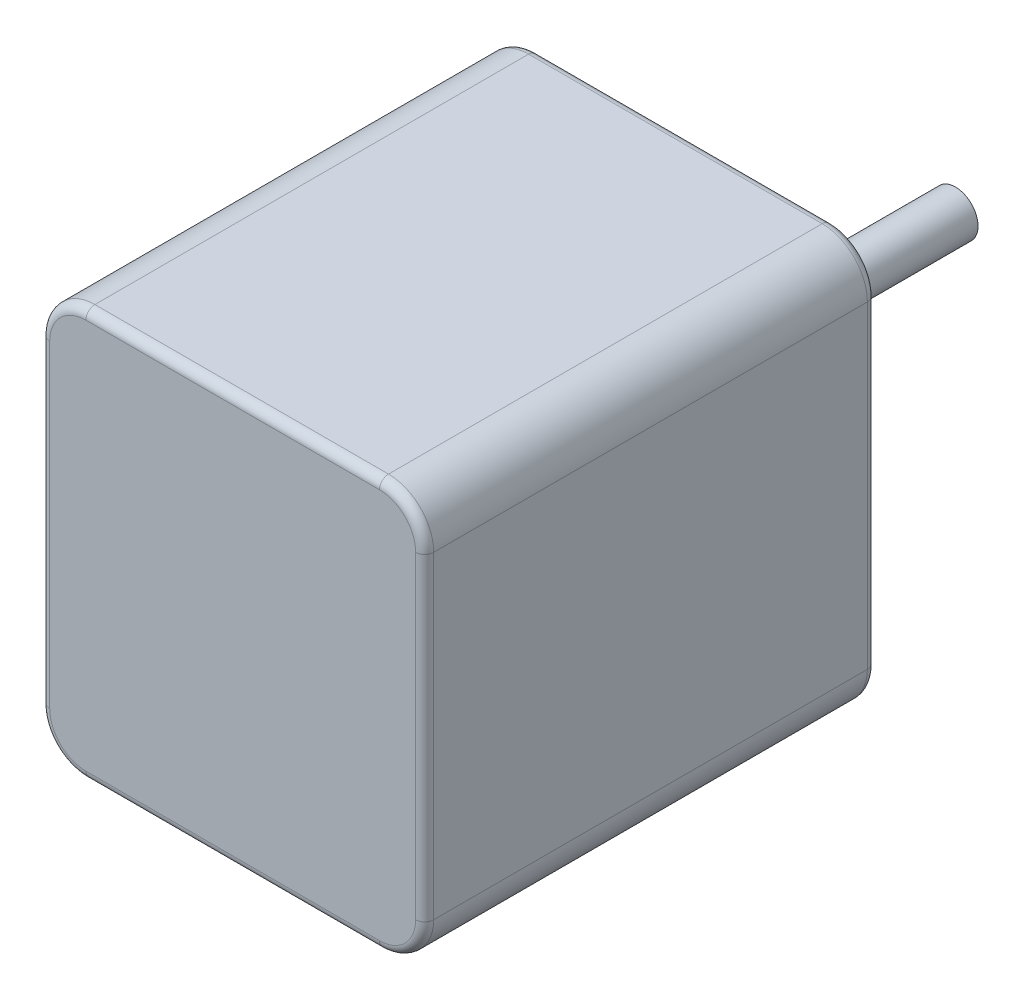
ISO-10303-21;
HEADER;
FILE_DESCRIPTION(('STEP AP214'),'2;1');
FILE_NAME('part.step','',(''),(''),'','','');
FILE_SCHEMA(('AUTOMOTIVE_DESIGN { 1 0 10303 214 1 1 1 1 }'));
ENDSEC;
DATA;
#1=APPLICATION_CONTEXT('core data for automotive mechanical design processes');
#2=APPLICATION_PROTOCOL_DEFINITION('international standard','automotive_design',2000,#1);
#3=PRODUCT_CONTEXT('',#1,'mechanical');
#4=PRODUCT('Part','Part','',(#3));
#5=PRODUCT_RELATED_PRODUCT_CATEGORY('part','',(#4));
#6=PRODUCT_DEFINITION_FORMATION('','',#4);
#7=PRODUCT_DEFINITION_CONTEXT('part definition',#1,'design');
#8=PRODUCT_DEFINITION('design','',#6,#7);
#9=PRODUCT_DEFINITION_SHAPE('','',#8);
#10=(LENGTH_UNIT() NAMED_UNIT(*) SI_UNIT(.MILLI.,.METRE.));
#11=(NAMED_UNIT(*) PLANE_ANGLE_UNIT() SI_UNIT($,.RADIAN.));
#12=(NAMED_UNIT(*) SI_UNIT($,.STERADIAN.) SOLID_ANGLE_UNIT());
#13=UNCERTAINTY_MEASURE_WITH_UNIT(LENGTH_MEASURE(1.E-05),#10,'distance_accuracy_value','');
#14=(GEOMETRIC_REPRESENTATION_CONTEXT(3) GLOBAL_UNCERTAINTY_ASSIGNED_CONTEXT((#13)) GLOBAL_UNIT_ASSIGNED_CONTEXT((#10,
#11,#12)) REPRESENTATION_CONTEXT('',''));
#15=CARTESIAN_POINT('',(0.,0.,0.));
#16=DIRECTION('',(0.,0.,1.));
#17=DIRECTION('',(1.,0.,0.));
#18=AXIS2_PLACEMENT_3D('',#15,#16,#17);
#19=CARTESIAN_POINT('',(21.25,-22.6104685857179,50.));
#20=DIRECTION('',(-1.,0.,0.));
#21=DIRECTION('',(0.,0.,1.));
#22=AXIS2_PLACEMENT_3D('',#19,#20,#21);
#23=PLANE('',#22);
#24=DIRECTION('',(0.,0.,-1.));
#25=VECTOR('',#24,1.);
#26=CARTESIAN_POINT('',(21.25,-17.6104685857179,50.));
#27=LINE('',#26,#25);
#28=CARTESIAN_POINT('',(21.25,-17.6104685857179,49.));
#29=VERTEX_POINT('',#28);
#30=CARTESIAN_POINT('',(21.25,-17.6104685857179,1.));
#31=VERTEX_POINT('',#30);
#32=EDGE_CURVE('E169',#29,#31,#27,.T.);
#33=ORIENTED_EDGE('',*,*,#32,.T.);
#34=DIRECTION('',(0.,1.,0.));
#35=VECTOR('',#34,1.);
#36=CARTESIAN_POINT('',(21.25,17.6104685857179,1.));
#37=LINE('',#36,#35);
#38=CARTESIAN_POINT('',(21.25,17.6104685857179,1.));
#39=VERTEX_POINT('',#38);
#40=EDGE_CURVE('E11',#31,#39,#37,.T.);
#41=ORIENTED_EDGE('',*,*,#40,.T.);
#42=DIRECTION('',(0.,0.,-1.));
#43=VECTOR('',#42,1.);
#44=CARTESIAN_POINT('',(21.25,17.6104685857179,50.));
#45=LINE('',#44,#43);
#46=CARTESIAN_POINT('',(21.25,17.6104685857179,49.));
#47=VERTEX_POINT('',#46);
#48=EDGE_CURVE('E285',#39,#47,#45,.F.);
#49=ORIENTED_EDGE('',*,*,#48,.T.);
#50=DIRECTION('',(0.,1.,0.));
#51=VECTOR('',#50,1.);
#52=CARTESIAN_POINT('',(21.25,-22.6104685857179,49.));
#53=LINE('',#52,#51);
#54=EDGE_CURVE('E176',#47,#29,#53,.F.);
#55=ORIENTED_EDGE('',*,*,#54,.T.);
#56=EDGE_LOOP('',(#33,#41,#49,#55));
#57=FACE_BOUND('',#56,.T.);
#58=ADVANCED_FACE('F33',(#57),#23,.F.);
#59=CARTESIAN_POINT('',(-21.25,22.6104685857179,50.));
#60=DIRECTION('',(0.,-1.,0.));
#61=DIRECTION('',(0.,0.,-1.));
#62=AXIS2_PLACEMENT_3D('',#59,#60,#61);
#63=PLANE('',#62);
#64=DIRECTION('',(0.,0.,-1.));
#65=VECTOR('',#64,1.);
#66=CARTESIAN_POINT('',(16.25,22.6104685857179,50.));
#67=LINE('',#66,#65);
#68=CARTESIAN_POINT('',(16.25,22.6104685857179,49.));
#69=VERTEX_POINT('',#68);
#70=CARTESIAN_POINT('',(16.25,22.6104685857179,1.));
#71=VERTEX_POINT('',#70);
#72=EDGE_CURVE('E317',#69,#71,#67,.T.);
#73=ORIENTED_EDGE('',*,*,#72,.T.);
#74=DIRECTION('',(-1.,0.,0.));
#75=VECTOR('',#74,1.);
#76=CARTESIAN_POINT('',(-16.25,22.6104685857179,1.));
#77=LINE('',#76,#75);
#78=CARTESIAN_POINT('',(-16.25,22.6104685857179,1.));
#79=VERTEX_POINT('',#78);
#80=EDGE_CURVE('E236',#71,#79,#77,.T.);
#81=ORIENTED_EDGE('',*,*,#80,.T.);
#82=DIRECTION('',(0.,0.,-1.));
#83=VECTOR('',#82,1.);
#84=CARTESIAN_POINT('',(-16.25,22.6104685857179,50.));
#85=LINE('',#84,#83);
#86=CARTESIAN_POINT('',(-16.25,22.6104685857179,49.));
#87=VERTEX_POINT('',#86);
#88=EDGE_CURVE('E289',#79,#87,#85,.F.);
#89=ORIENTED_EDGE('',*,*,#88,.T.);
#90=DIRECTION('',(-1.,0.,0.));
#91=VECTOR('',#90,1.);
#92=CARTESIAN_POINT('',(-21.25,22.6104685857179,49.));
#93=LINE('',#92,#91);
#94=EDGE_CURVE('E196',#87,#69,#93,.F.);
#95=ORIENTED_EDGE('',*,*,#94,.T.);
#96=EDGE_LOOP('',(#73,#81,#89,#95));
#97=FACE_BOUND('',#96,.T.);
#98=ADVANCED_FACE('F349',(#97),#63,.F.);
#99=CARTESIAN_POINT('',(-21.25,-22.6104685857179,50.));
#100=DIRECTION('',(1.,0.,0.));
#101=DIRECTION('',(0.,0.,-1.));
#102=AXIS2_PLACEMENT_3D('',#99,#100,#101);
#103=PLANE('',#102);
#104=DIRECTION('',(0.,0.,-1.));
#105=VECTOR('',#104,1.);
#106=CARTESIAN_POINT('',(-21.25,17.6104685857179,50.));
#107=LINE('',#106,#105);
#108=CARTESIAN_POINT('',(-21.25,17.6104685857179,49.));
#109=VERTEX_POINT('',#108);
#110=CARTESIAN_POINT('',(-21.25,17.6104685857179,1.));
#111=VERTEX_POINT('',#110);
#112=EDGE_CURVE('E319',#109,#111,#107,.T.);
#113=ORIENTED_EDGE('',*,*,#112,.T.);
#114=DIRECTION('',(0.,-1.,0.));
#115=VECTOR('',#114,1.);
#116=CARTESIAN_POINT('',(-21.25,-17.6104685857179,1.));
#117=LINE('',#116,#115);
#118=CARTESIAN_POINT('',(-21.25,-17.6104685857179,1.));
#119=VERTEX_POINT('',#118);
#120=EDGE_CURVE('E240',#111,#119,#117,.T.);
#121=ORIENTED_EDGE('',*,*,#120,.T.);
#122=DIRECTION('',(0.,0.,-1.));
#123=VECTOR('',#122,1.);
#124=CARTESIAN_POINT('',(-21.25,-17.6104685857179,50.));
#125=LINE('',#124,#123);
#126=CARTESIAN_POINT('',(-21.25,-17.6104685857179,49.));
#127=VERTEX_POINT('',#126);
#128=EDGE_CURVE('E282',#119,#127,#125,.F.);
#129=ORIENTED_EDGE('',*,*,#128,.T.);
#130=DIRECTION('',(0.,-1.,0.));
#131=VECTOR('',#130,1.);
#132=CARTESIAN_POINT('',(-21.25,-22.6104685857179,49.));
#133=LINE('',#132,#131);
#134=EDGE_CURVE('E191',#127,#109,#133,.F.);
#135=ORIENTED_EDGE('',*,*,#134,.T.);
#136=EDGE_LOOP('',(#113,#121,#129,#135));
#137=FACE_BOUND('',#136,.T.);
#138=ADVANCED_FACE('F354',(#137),#103,.F.);
#139=CARTESIAN_POINT('',(-21.25,-22.6104685857179,50.));
#140=DIRECTION('',(0.,1.,0.));
#141=DIRECTION('',(0.,0.,1.));
#142=AXIS2_PLACEMENT_3D('',#139,#140,#141);
#143=PLANE('',#142);
#144=DIRECTION('',(0.,0.,-1.));
#145=VECTOR('',#144,1.);
#146=CARTESIAN_POINT('',(-16.25,-22.6104685857179,50.));
#147=LINE('',#146,#145);
#148=CARTESIAN_POINT('',(-16.25,-22.6104685857179,49.));
#149=VERTEX_POINT('',#148);
#150=CARTESIAN_POINT('',(-16.25,-22.6104685857179,1.));
#151=VERTEX_POINT('',#150);
#152=EDGE_CURVE('E280',#149,#151,#147,.T.);
#153=ORIENTED_EDGE('',*,*,#152,.T.);
#154=DIRECTION('',(1.,0.,0.));
#155=VECTOR('',#154,1.);
#156=CARTESIAN_POINT('',(16.25,-22.6104685857179,1.));
#157=LINE('',#156,#155);
#158=CARTESIAN_POINT('',(16.25,-22.6104685857179,1.));
#159=VERTEX_POINT('',#158);
#160=EDGE_CURVE('E57',#151,#159,#157,.T.);
#161=ORIENTED_EDGE('',*,*,#160,.T.);
#162=DIRECTION('',(0.,0.,-1.));
#163=VECTOR('',#162,1.);
#164=CARTESIAN_POINT('',(16.25,-22.6104685857179,50.));
#165=LINE('',#164,#163);
#166=CARTESIAN_POINT('',(16.25,-22.6104685857179,49.));
#167=VERTEX_POINT('',#166);
#168=EDGE_CURVE('E286',#159,#167,#165,.F.);
#169=ORIENTED_EDGE('',*,*,#168,.T.);
#170=DIRECTION('',(1.,0.,0.));
#171=VECTOR('',#170,1.);
#172=CARTESIAN_POINT('',(-21.25,-22.6104685857179,49.));
#173=LINE('',#172,#171);
#174=EDGE_CURVE('E186',#167,#149,#173,.F.);
#175=ORIENTED_EDGE('',*,*,#174,.T.);
#176=EDGE_LOOP('',(#153,#161,#169,#175));
#177=FACE_BOUND('',#176,.T.);
#178=ADVANCED_FACE('F283',(#177),#143,.F.);
#179=CARTESIAN_POINT('',(0.,0.,50.));
#180=DIRECTION('',(0.,0.,-1.));
#181=DIRECTION('',(-1.,0.,0.));
#182=AXIS2_PLACEMENT_3D('',#179,#180,#181);
#183=PLANE('',#182);
#184=DIRECTION('',(0.,1.,0.));
#185=VECTOR('',#184,1.);
#186=CARTESIAN_POINT('',(20.25,0.,50.));
#187=LINE('',#186,#185);
#188=CARTESIAN_POINT('',(20.25,-17.6104685857179,50.));
#189=VERTEX_POINT('',#188);
#190=CARTESIAN_POINT('',(20.25,17.6104685857179,50.));
#191=VERTEX_POINT('',#190);
#192=EDGE_CURVE('E173',#189,#191,#187,.T.);
#193=ORIENTED_EDGE('',*,*,#192,.T.);
#194=CARTESIAN_POINT('',(16.25,17.6104685857179,50.));
#195=DIRECTION('',(0.,0.,-1.));
#196=DIRECTION('',(-1.,0.,0.));
#197=AXIS2_PLACEMENT_3D('',#194,#195,#196);
#198=CIRCLE('',#197,4.);
#199=CARTESIAN_POINT('',(16.25,21.6104685857179,50.));
#200=VERTEX_POINT('',#199);
#201=EDGE_CURVE('E154',#191,#200,#198,.F.);
#202=ORIENTED_EDGE('',*,*,#201,.T.);
#203=DIRECTION('',(-1.,0.,0.));
#204=VECTOR('',#203,1.);
#205=CARTESIAN_POINT('',(0.,21.6104685857179,50.));
#206=LINE('',#205,#204);
#207=CARTESIAN_POINT('',(-16.25,21.6104685857179,50.));
#208=VERTEX_POINT('',#207);
#209=EDGE_CURVE('E162',#200,#208,#206,.T.);
#210=ORIENTED_EDGE('',*,*,#209,.T.);
#211=CARTESIAN_POINT('',(-16.25,17.6104685857179,50.));
#212=DIRECTION('',(0.,0.,-1.));
#213=DIRECTION('',(-1.,0.,0.));
#214=AXIS2_PLACEMENT_3D('',#211,#212,#213);
#215=CIRCLE('',#214,4.);
#216=CARTESIAN_POINT('',(-20.25,17.6104685857179,50.));
#217=VERTEX_POINT('',#216);
#218=EDGE_CURVE('E168',#208,#217,#215,.F.);
#219=ORIENTED_EDGE('',*,*,#218,.T.);
#220=DIRECTION('',(0.,-1.,0.));
#221=VECTOR('',#220,1.);
#222=CARTESIAN_POINT('',(-20.25,0.,50.));
#223=LINE('',#222,#221);
#224=CARTESIAN_POINT('',(-20.25,-17.6104685857179,50.));
#225=VERTEX_POINT('',#224);
#226=EDGE_CURVE('E295',#217,#225,#223,.T.);
#227=ORIENTED_EDGE('',*,*,#226,.T.);
#228=CARTESIAN_POINT('',(-16.25,-17.6104685857179,50.));
#229=DIRECTION('',(0.,0.,-1.));
#230=DIRECTION('',(-1.,0.,0.));
#231=AXIS2_PLACEMENT_3D('',#228,#229,#230);
#232=CIRCLE('',#231,4.);
#233=CARTESIAN_POINT('',(-16.25,-21.6104685857179,50.));
#234=VERTEX_POINT('',#233);
#235=EDGE_CURVE('E297',#225,#234,#232,.F.);
#236=ORIENTED_EDGE('',*,*,#235,.T.);
#237=DIRECTION('',(1.,0.,0.));
#238=VECTOR('',#237,1.);
#239=CARTESIAN_POINT('',(0.,-21.6104685857179,50.));
#240=LINE('',#239,#238);
#241=CARTESIAN_POINT('',(16.25,-21.6104685857179,50.));
#242=VERTEX_POINT('',#241);
#243=EDGE_CURVE('E299',#234,#242,#240,.T.);
#244=ORIENTED_EDGE('',*,*,#243,.T.);
#245=CARTESIAN_POINT('',(16.25,-17.6104685857179,50.));
#246=DIRECTION('',(0.,0.,-1.));
#247=DIRECTION('',(-1.,0.,0.));
#248=AXIS2_PLACEMENT_3D('',#245,#246,#247);
#249=CIRCLE('',#248,4.);
#250=EDGE_CURVE('E178',#242,#189,#249,.F.);
#251=ORIENTED_EDGE('',*,*,#250,.T.);
#252=EDGE_LOOP('',(#193,#202,#210,#219,#227,#236,#244,#251));
#253=FACE_BOUND('',#252,.T.);
#254=ADVANCED_FACE('F171',(#253),#183,.F.);
#255=CARTESIAN_POINT('',(0.,0.,0.));
#256=DIRECTION('',(0.,0.,-1.));
#257=DIRECTION('',(-1.,0.,0.));
#258=AXIS2_PLACEMENT_3D('',#255,#256,#257);
#259=PLANE('',#258);
#260=DIRECTION('',(-1.,0.,0.));
#261=VECTOR('',#260,1.);
#262=CARTESIAN_POINT('',(16.25,21.6104685857179,0.));
#263=LINE('',#262,#261);
#264=CARTESIAN_POINT('',(-16.25,21.6104685857179,0.));
#265=VERTEX_POINT('',#264);
#266=CARTESIAN_POINT('',(16.25,21.6104685857179,0.));
#267=VERTEX_POINT('',#266);
#268=EDGE_CURVE('E228',#265,#267,#263,.F.);
#269=ORIENTED_EDGE('',*,*,#268,.T.);
#270=CARTESIAN_POINT('',(16.25,17.6104685857179,0.));
#271=DIRECTION('',(0.,0.,-1.));
#272=DIRECTION('',(-1.,0.,0.));
#273=AXIS2_PLACEMENT_3D('',#270,#271,#272);
#274=CIRCLE('',#273,4.);
#275=CARTESIAN_POINT('',(20.25,17.6104685857179,0.));
#276=VERTEX_POINT('',#275);
#277=EDGE_CURVE('E230',#267,#276,#274,.T.);
#278=ORIENTED_EDGE('',*,*,#277,.T.);
#279=DIRECTION('',(0.,1.,0.));
#280=VECTOR('',#279,1.);
#281=CARTESIAN_POINT('',(20.25,-17.6104685857179,0.));
#282=LINE('',#281,#280);
#283=CARTESIAN_POINT('',(20.25,-17.6104685857179,0.));
#284=VERTEX_POINT('',#283);
#285=EDGE_CURVE('E197',#276,#284,#282,.F.);
#286=ORIENTED_EDGE('',*,*,#285,.T.);
#287=CARTESIAN_POINT('',(16.25,-17.6104685857179,0.));
#288=DIRECTION('',(0.,0.,-1.));
#289=DIRECTION('',(-1.,0.,0.));
#290=AXIS2_PLACEMENT_3D('',#287,#288,#289);
#291=CIRCLE('',#290,4.);
#292=CARTESIAN_POINT('',(16.25,-21.6104685857179,0.));
#293=VERTEX_POINT('',#292);
#294=EDGE_CURVE('E218',#284,#293,#291,.T.);
#295=ORIENTED_EDGE('',*,*,#294,.T.);
#296=DIRECTION('',(1.,0.,0.));
#297=VECTOR('',#296,1.);
#298=CARTESIAN_POINT('',(-16.25,-21.6104685857179,0.));
#299=LINE('',#298,#297);
#300=CARTESIAN_POINT('',(-16.25,-21.6104685857179,0.));
#301=VERTEX_POINT('',#300);
#302=EDGE_CURVE('E220',#293,#301,#299,.F.);
#303=ORIENTED_EDGE('',*,*,#302,.T.);
#304=CARTESIAN_POINT('',(-16.25,-17.6104685857179,0.));
#305=DIRECTION('',(0.,0.,-1.));
#306=DIRECTION('',(-1.,0.,0.));
#307=AXIS2_PLACEMENT_3D('',#304,#305,#306);
#308=CIRCLE('',#307,4.);
#309=CARTESIAN_POINT('',(-20.25,-17.6104685857179,0.));
#310=VERTEX_POINT('',#309);
#311=EDGE_CURVE('E222',#301,#310,#308,.T.);
#312=ORIENTED_EDGE('',*,*,#311,.T.);
#313=DIRECTION('',(0.,-1.,0.));
#314=VECTOR('',#313,1.);
#315=CARTESIAN_POINT('',(-20.25,17.6104685857179,0.));
#316=LINE('',#315,#314);
#317=CARTESIAN_POINT('',(-20.25,17.6104685857179,0.));
#318=VERTEX_POINT('',#317);
#319=EDGE_CURVE('E224',#310,#318,#316,.F.);
#320=ORIENTED_EDGE('',*,*,#319,.T.);
#321=CARTESIAN_POINT('',(-16.25,17.6104685857179,0.));
#322=DIRECTION('',(0.,0.,-1.));
#323=DIRECTION('',(-1.,0.,0.));
#324=AXIS2_PLACEMENT_3D('',#321,#322,#323);
#325=CIRCLE('',#324,4.);
#326=EDGE_CURVE('E226',#318,#265,#325,.T.);
#327=ORIENTED_EDGE('',*,*,#326,.T.);
#328=EDGE_LOOP('',(#269,#278,#286,#295,#303,#312,#320,#327));
#329=FACE_BOUND('',#328,.T.);
#330=CARTESIAN_POINT('',(0.,0.,0.));
#331=DIRECTION('',(0.,0.,-1.));
#332=DIRECTION('',(-1.,0.,0.));
#333=AXIS2_PLACEMENT_3D('',#330,#331,#332);
#334=CIRCLE('',#333,2.5);
#335=CARTESIAN_POINT('',(-2.5,0.,0.));
#336=VERTEX_POINT('',#335);
#337=EDGE_CURVE('E216',#336,#336,#334,.T.);
#338=ORIENTED_EDGE('',*,*,#337,.F.);
#339=EDGE_LOOP('',(#338));
#340=FACE_BOUND('',#339,.T.);
#341=ADVANCED_FACE('F336',(#329,#340),#259,.T.);
#342=CARTESIAN_POINT('',(0.,0.,-30.));
#343=DIRECTION('',(0.,0.,1.));
#344=DIRECTION('',(1.,0.,0.));
#345=AXIS2_PLACEMENT_3D('',#342,#343,#344);
#346=CYLINDRICAL_SURFACE('',#345,2.5);
#347=CARTESIAN_POINT('',(0.,0.,-30.));
#348=DIRECTION('',(0.,0.,-1.));
#349=DIRECTION('',(-1.,0.,0.));
#350=AXIS2_PLACEMENT_3D('',#347,#348,#349);
#351=CIRCLE('',#350,2.5);
#352=CARTESIAN_POINT('',(-2.5,0.,-30.));
#353=VERTEX_POINT('',#352);
#354=EDGE_CURVE('E325',#353,#353,#351,.T.);
#355=ORIENTED_EDGE('',*,*,#354,.F.);
#356=EDGE_LOOP('',(#355));
#357=FACE_BOUND('',#356,.T.);
#358=ORIENTED_EDGE('',*,*,#337,.T.);
#359=EDGE_LOOP('',(#358));
#360=FACE_BOUND('',#359,.T.);
#361=ADVANCED_FACE('F333',(#357,#360),#346,.T.);
#362=CARTESIAN_POINT('',(0.,0.,-30.));
#363=DIRECTION('',(0.,0.,-1.));
#364=DIRECTION('',(-1.,0.,0.));
#365=AXIS2_PLACEMENT_3D('',#362,#363,#364);
#366=PLANE('',#365);
#367=ORIENTED_EDGE('',*,*,#354,.T.);
#368=EDGE_LOOP('',(#367));
#369=FACE_BOUND('',#368,.T.);
#370=ADVANCED_FACE('F331',(#369),#366,.T.);
#371=CARTESIAN_POINT('',(-16.25,17.6104685857179,50.));
#372=DIRECTION('',(0.,0.,-1.));
#373=DIRECTION('',(-1.,0.,0.));
#374=AXIS2_PLACEMENT_3D('',#371,#372,#373);
#375=CYLINDRICAL_SURFACE('',#374,5.);
#376=ORIENTED_EDGE('',*,*,#88,.F.);
#377=CARTESIAN_POINT('',(-16.25,17.6104685857179,1.));
#378=DIRECTION('',(0.,0.,-1.));
#379=DIRECTION('',(-1.,0.,0.));
#380=AXIS2_PLACEMENT_3D('',#377,#378,#379);
#381=CIRCLE('',#380,5.);
#382=EDGE_CURVE('E238',#79,#111,#381,.F.);
#383=ORIENTED_EDGE('',*,*,#382,.T.);
#384=ORIENTED_EDGE('',*,*,#112,.F.);
#385=CARTESIAN_POINT('',(-16.25,17.6104685857179,49.));
#386=DIRECTION('',(0.,0.,-1.));
#387=DIRECTION('',(-1.,0.,0.));
#388=AXIS2_PLACEMENT_3D('',#385,#386,#387);
#389=CIRCLE('',#388,5.);
#390=EDGE_CURVE('E193',#109,#87,#389,.T.);
#391=ORIENTED_EDGE('',*,*,#390,.T.);
#392=EDGE_LOOP('',(#376,#383,#384,#391));
#393=FACE_BOUND('',#392,.T.);
#394=ADVANCED_FACE('F358',(#393),#375,.T.);
#395=CARTESIAN_POINT('',(-16.25,-17.6104685857179,50.));
#396=DIRECTION('',(0.,0.,-1.));
#397=DIRECTION('',(-1.,0.,0.));
#398=AXIS2_PLACEMENT_3D('',#395,#396,#397);
#399=CYLINDRICAL_SURFACE('',#398,5.);
#400=ORIENTED_EDGE('',*,*,#128,.F.);
#401=CARTESIAN_POINT('',(-16.25,-17.6104685857179,1.));
#402=DIRECTION('',(0.,0.,-1.));
#403=DIRECTION('',(-1.,0.,0.));
#404=AXIS2_PLACEMENT_3D('',#401,#402,#403);
#405=CIRCLE('',#404,5.);
#406=EDGE_CURVE('E242',#119,#151,#405,.F.);
#407=ORIENTED_EDGE('',*,*,#406,.T.);
#408=ORIENTED_EDGE('',*,*,#152,.F.);
#409=CARTESIAN_POINT('',(-16.25,-17.6104685857179,49.));
#410=DIRECTION('',(0.,0.,-1.));
#411=DIRECTION('',(-1.,0.,0.));
#412=AXIS2_PLACEMENT_3D('',#409,#410,#411);
#413=CIRCLE('',#412,5.);
#414=EDGE_CURVE('E188',#149,#127,#413,.T.);
#415=ORIENTED_EDGE('',*,*,#414,.T.);
#416=EDGE_LOOP('',(#400,#407,#408,#415));
#417=FACE_BOUND('',#416,.T.);
#418=ADVANCED_FACE('F279',(#417),#399,.T.);
#419=CARTESIAN_POINT('',(16.25,-17.6104685857179,50.));
#420=DIRECTION('',(0.,0.,-1.));
#421=DIRECTION('',(-1.,0.,0.));
#422=AXIS2_PLACEMENT_3D('',#419,#420,#421);
#423=CYLINDRICAL_SURFACE('',#422,5.);
#424=ORIENTED_EDGE('',*,*,#168,.F.);
#425=CARTESIAN_POINT('',(16.25,-17.6104685857179,1.));
#426=DIRECTION('',(0.,0.,-1.));
#427=DIRECTION('',(-1.,0.,0.));
#428=AXIS2_PLACEMENT_3D('',#425,#426,#427);
#429=CIRCLE('',#428,5.);
#430=EDGE_CURVE('E42',#159,#31,#429,.F.);
#431=ORIENTED_EDGE('',*,*,#430,.T.);
#432=ORIENTED_EDGE('',*,*,#32,.F.);
#433=CARTESIAN_POINT('',(16.25,-17.6104685857179,49.));
#434=DIRECTION('',(0.,0.,-1.));
#435=DIRECTION('',(-1.,0.,0.));
#436=AXIS2_PLACEMENT_3D('',#433,#434,#435);
#437=CIRCLE('',#436,5.);
#438=EDGE_CURVE('E183',#29,#167,#437,.T.);
#439=ORIENTED_EDGE('',*,*,#438,.T.);
#440=EDGE_LOOP('',(#424,#431,#432,#439));
#441=FACE_BOUND('',#440,.T.);
#442=ADVANCED_FACE('F364',(#441),#423,.T.);
#443=CARTESIAN_POINT('',(16.25,17.6104685857179,50.));
#444=DIRECTION('',(0.,0.,-1.));
#445=DIRECTION('',(-1.,0.,0.));
#446=AXIS2_PLACEMENT_3D('',#443,#444,#445);
#447=CYLINDRICAL_SURFACE('',#446,5.);
#448=ORIENTED_EDGE('',*,*,#48,.F.);
#449=CARTESIAN_POINT('',(16.25,17.6104685857179,1.));
#450=DIRECTION('',(0.,0.,-1.));
#451=DIRECTION('',(-1.,0.,0.));
#452=AXIS2_PLACEMENT_3D('',#449,#450,#451);
#453=CIRCLE('',#452,5.);
#454=EDGE_CURVE('E233',#39,#71,#453,.F.);
#455=ORIENTED_EDGE('',*,*,#454,.T.);
#456=ORIENTED_EDGE('',*,*,#72,.F.);
#457=CARTESIAN_POINT('',(16.25,17.6104685857179,49.));
#458=DIRECTION('',(0.,0.,-1.));
#459=DIRECTION('',(-1.,0.,0.));
#460=AXIS2_PLACEMENT_3D('',#457,#458,#459);
#461=CIRCLE('',#460,5.);
#462=EDGE_CURVE('E156',#69,#47,#461,.T.);
#463=ORIENTED_EDGE('',*,*,#462,.T.);
#464=EDGE_LOOP('',(#448,#455,#456,#463));
#465=FACE_BOUND('',#464,.T.);
#466=ADVANCED_FACE('F314',(#465),#447,.T.);
#467=CARTESIAN_POINT('',(-16.25,-17.6104685857179,49.));
#468=DIRECTION('',(0.,0.,-1.));
#469=DIRECTION('',(-1.,0.,0.));
#470=AXIS2_PLACEMENT_3D('',#467,#468,#469);
#471=TOROIDAL_SURFACE('',#470,4.,1.);
#472=CARTESIAN_POINT('',(-20.25,-17.6104685857179,49.));
#473=DIRECTION('',(0.,1.,0.));
#474=DIRECTION('',(0.,0.,1.));
#475=AXIS2_PLACEMENT_3D('',#472,#473,#474);
#476=CIRCLE('',#475,1.);
#477=EDGE_CURVE('E210',#127,#225,#476,.T.);
#478=ORIENTED_EDGE('',*,*,#477,.F.);
#479=ORIENTED_EDGE('',*,*,#414,.F.);
#480=CARTESIAN_POINT('',(-16.25,-21.6104685857179,49.));
#481=DIRECTION('',(1.,0.,0.));
#482=DIRECTION('',(0.,0.,-1.));
#483=AXIS2_PLACEMENT_3D('',#480,#481,#482);
#484=CIRCLE('',#483,1.);
#485=EDGE_CURVE('E213',#234,#149,#484,.T.);
#486=ORIENTED_EDGE('',*,*,#485,.F.);
#487=ORIENTED_EDGE('',*,*,#235,.F.);
#488=EDGE_LOOP('',(#478,#479,#486,#487));
#489=FACE_BOUND('',#488,.T.);
#490=ADVANCED_FACE('F369',(#489),#471,.T.);
#491=CARTESIAN_POINT('',(0.,-21.6104685857179,49.));
#492=DIRECTION('',(1.,0.,0.));
#493=DIRECTION('',(0.,0.,-1.));
#494=AXIS2_PLACEMENT_3D('',#491,#492,#493);
#495=CYLINDRICAL_SURFACE('',#494,1.);
#496=ORIENTED_EDGE('',*,*,#485,.T.);
#497=ORIENTED_EDGE('',*,*,#174,.F.);
#498=CARTESIAN_POINT('',(16.25,-21.6104685857179,49.));
#499=DIRECTION('',(1.,0.,0.));
#500=DIRECTION('',(0.,0.,-1.));
#501=AXIS2_PLACEMENT_3D('',#498,#499,#500);
#502=CIRCLE('',#501,1.);
#503=EDGE_CURVE('E207',#242,#167,#502,.T.);
#504=ORIENTED_EDGE('',*,*,#503,.F.);
#505=ORIENTED_EDGE('',*,*,#243,.F.);
#506=EDGE_LOOP('',(#496,#497,#504,#505));
#507=FACE_BOUND('',#506,.T.);
#508=ADVANCED_FACE('F385',(#507),#495,.T.);
#509=CARTESIAN_POINT('',(-20.25,0.,49.));
#510=DIRECTION('',(0.,-1.,0.));
#511=DIRECTION('',(0.,0.,-1.));
#512=AXIS2_PLACEMENT_3D('',#509,#510,#511);
#513=CYLINDRICAL_SURFACE('',#512,1.);
#514=ORIENTED_EDGE('',*,*,#477,.T.);
#515=ORIENTED_EDGE('',*,*,#226,.F.);
#516=CARTESIAN_POINT('',(-20.25,17.6104685857179,49.));
#517=DIRECTION('',(0.,1.,0.));
#518=DIRECTION('',(0.,0.,1.));
#519=AXIS2_PLACEMENT_3D('',#516,#517,#518);
#520=CIRCLE('',#519,1.);
#521=EDGE_CURVE('E204',#109,#217,#520,.T.);
#522=ORIENTED_EDGE('',*,*,#521,.F.);
#523=ORIENTED_EDGE('',*,*,#134,.F.);
#524=EDGE_LOOP('',(#514,#515,#522,#523));
#525=FACE_BOUND('',#524,.T.);
#526=ADVANCED_FACE('F382',(#525),#513,.T.);
#527=CARTESIAN_POINT('',(16.25,-17.6104685857179,49.));
#528=DIRECTION('',(0.,0.,-1.));
#529=DIRECTION('',(-1.,0.,0.));
#530=AXIS2_PLACEMENT_3D('',#527,#528,#529);
#531=TOROIDAL_SURFACE('',#530,4.,1.);
#532=ORIENTED_EDGE('',*,*,#503,.T.);
#533=ORIENTED_EDGE('',*,*,#438,.F.);
#534=CARTESIAN_POINT('',(20.25,-17.6104685857179,49.));
#535=DIRECTION('',(0.,1.,0.));
#536=DIRECTION('',(0.,0.,1.));
#537=AXIS2_PLACEMENT_3D('',#534,#535,#536);
#538=CIRCLE('',#537,1.);
#539=EDGE_CURVE('E201',#189,#29,#538,.T.);
#540=ORIENTED_EDGE('',*,*,#539,.F.);
#541=ORIENTED_EDGE('',*,*,#250,.F.);
#542=EDGE_LOOP('',(#532,#533,#540,#541));
#543=FACE_BOUND('',#542,.T.);
#544=ADVANCED_FACE('F306',(#543),#531,.T.);
#545=CARTESIAN_POINT('',(-16.25,17.6104685857179,49.));
#546=DIRECTION('',(0.,0.,-1.));
#547=DIRECTION('',(-1.,0.,0.));
#548=AXIS2_PLACEMENT_3D('',#545,#546,#547);
#549=TOROIDAL_SURFACE('',#548,4.,1.);
#550=ORIENTED_EDGE('',*,*,#521,.T.);
#551=ORIENTED_EDGE('',*,*,#218,.F.);
#552=CARTESIAN_POINT('',(-16.25,21.6104685857179,49.));
#553=DIRECTION('',(1.,0.,0.));
#554=DIRECTION('',(0.,0.,-1.));
#555=AXIS2_PLACEMENT_3D('',#552,#553,#554);
#556=CIRCLE('',#555,1.);
#557=EDGE_CURVE('E165',#87,#208,#556,.T.);
#558=ORIENTED_EDGE('',*,*,#557,.F.);
#559=ORIENTED_EDGE('',*,*,#390,.F.);
#560=EDGE_LOOP('',(#550,#551,#558,#559));
#561=FACE_BOUND('',#560,.T.);
#562=ADVANCED_FACE('F376',(#561),#549,.T.);
#563=CARTESIAN_POINT('',(20.25,0.,49.));
#564=DIRECTION('',(0.,1.,0.));
#565=DIRECTION('',(0.,0.,1.));
#566=AXIS2_PLACEMENT_3D('',#563,#564,#565);
#567=CYLINDRICAL_SURFACE('',#566,1.);
#568=ORIENTED_EDGE('',*,*,#539,.T.);
#569=ORIENTED_EDGE('',*,*,#54,.F.);
#570=CARTESIAN_POINT('',(20.25,17.6104685857179,49.));
#571=DIRECTION('',(0.,1.,0.));
#572=DIRECTION('',(0.,0.,1.));
#573=AXIS2_PLACEMENT_3D('',#570,#571,#572);
#574=CIRCLE('',#573,1.);
#575=EDGE_CURVE('E159',#191,#47,#574,.T.);
#576=ORIENTED_EDGE('',*,*,#575,.F.);
#577=ORIENTED_EDGE('',*,*,#192,.F.);
#578=EDGE_LOOP('',(#568,#569,#576,#577));
#579=FACE_BOUND('',#578,.T.);
#580=ADVANCED_FACE('F309',(#579),#567,.T.);
#581=CARTESIAN_POINT('',(0.,21.6104685857179,49.));
#582=DIRECTION('',(-1.,0.,0.));
#583=DIRECTION('',(0.,0.,1.));
#584=AXIS2_PLACEMENT_3D('',#581,#582,#583);
#585=CYLINDRICAL_SURFACE('',#584,1.);
#586=ORIENTED_EDGE('',*,*,#557,.T.);
#587=ORIENTED_EDGE('',*,*,#209,.F.);
#588=CARTESIAN_POINT('',(16.25,21.6104685857179,49.));
#589=DIRECTION('',(1.,0.,0.));
#590=DIRECTION('',(0.,0.,-1.));
#591=AXIS2_PLACEMENT_3D('',#588,#589,#590);
#592=CIRCLE('',#591,1.);
#593=EDGE_CURVE('E149',#69,#200,#592,.T.);
#594=ORIENTED_EDGE('',*,*,#593,.F.);
#595=ORIENTED_EDGE('',*,*,#94,.F.);
#596=EDGE_LOOP('',(#586,#587,#594,#595));
#597=FACE_BOUND('',#596,.T.);
#598=ADVANCED_FACE('F163',(#597),#585,.T.);
#599=CARTESIAN_POINT('',(16.25,17.6104685857179,49.));
#600=DIRECTION('',(0.,0.,-1.));
#601=DIRECTION('',(-1.,0.,0.));
#602=AXIS2_PLACEMENT_3D('',#599,#600,#601);
#603=TOROIDAL_SURFACE('',#602,4.,1.);
#604=ORIENTED_EDGE('',*,*,#575,.T.);
#605=ORIENTED_EDGE('',*,*,#462,.F.);
#606=ORIENTED_EDGE('',*,*,#593,.T.);
#607=ORIENTED_EDGE('',*,*,#201,.F.);
#608=EDGE_LOOP('',(#604,#605,#606,#607));
#609=FACE_BOUND('',#608,.T.);
#610=ADVANCED_FACE('F152',(#609),#603,.T.);
#611=CARTESIAN_POINT('',(-16.25,-17.6104685857179,1.));
#612=DIRECTION('',(0.,0.,-1.));
#613=DIRECTION('',(-1.,0.,0.));
#614=AXIS2_PLACEMENT_3D('',#611,#612,#613);
#615=TOROIDAL_SURFACE('',#614,4.,1.);
#616=CARTESIAN_POINT('',(-16.25,-21.6104685857179,1.));
#617=DIRECTION('',(1.,0.,0.));
#618=DIRECTION('',(0.,0.,-1.));
#619=AXIS2_PLACEMENT_3D('',#616,#617,#618);
#620=CIRCLE('',#619,1.);
#621=EDGE_CURVE('E261',#151,#301,#620,.T.);
#622=ORIENTED_EDGE('',*,*,#621,.F.);
#623=ORIENTED_EDGE('',*,*,#406,.F.);
#624=CARTESIAN_POINT('',(-20.25,-17.6104685857179,1.));
#625=DIRECTION('',(0.,1.,0.));
#626=DIRECTION('',(0.,0.,1.));
#627=AXIS2_PLACEMENT_3D('',#624,#625,#626);
#628=CIRCLE('',#627,1.);
#629=EDGE_CURVE('E37',#310,#119,#628,.T.);
#630=ORIENTED_EDGE('',*,*,#629,.F.);
#631=ORIENTED_EDGE('',*,*,#311,.F.);
#632=EDGE_LOOP('',(#622,#623,#630,#631));
#633=FACE_BOUND('',#632,.T.);
#634=ADVANCED_FACE('F35',(#633),#615,.T.);
#635=CARTESIAN_POINT('',(-20.25,-22.6104685857179,1.));
#636=DIRECTION('',(0.,1.,0.));
#637=DIRECTION('',(0.,0.,1.));
#638=AXIS2_PLACEMENT_3D('',#635,#636,#637);
#639=CYLINDRICAL_SURFACE('',#638,1.);
#640=ORIENTED_EDGE('',*,*,#629,.T.);
#641=ORIENTED_EDGE('',*,*,#120,.F.);
#642=CARTESIAN_POINT('',(-20.25,17.6104685857179,1.));
#643=DIRECTION('',(0.,1.,0.));
#644=DIRECTION('',(0.,0.,1.));
#645=AXIS2_PLACEMENT_3D('',#642,#643,#644);
#646=CIRCLE('',#645,1.);
#647=EDGE_CURVE('E259',#318,#111,#646,.T.);
#648=ORIENTED_EDGE('',*,*,#647,.F.);
#649=ORIENTED_EDGE('',*,*,#319,.F.);
#650=EDGE_LOOP('',(#640,#641,#648,#649));
#651=FACE_BOUND('',#650,.T.);
#652=ADVANCED_FACE('F271',(#651),#639,.T.);
#653=CARTESIAN_POINT('',(-21.25,-21.6104685857179,1.));
#654=DIRECTION('',(-1.,0.,0.));
#655=DIRECTION('',(0.,0.,1.));
#656=AXIS2_PLACEMENT_3D('',#653,#654,#655);
#657=CYLINDRICAL_SURFACE('',#656,1.);
#658=ORIENTED_EDGE('',*,*,#621,.T.);
#659=ORIENTED_EDGE('',*,*,#302,.F.);
#660=CARTESIAN_POINT('',(16.25,-21.6104685857179,1.));
#661=DIRECTION('',(1.,0.,0.));
#662=DIRECTION('',(0.,0.,-1.));
#663=AXIS2_PLACEMENT_3D('',#660,#661,#662);
#664=CIRCLE('',#663,1.);
#665=EDGE_CURVE('E256',#159,#293,#664,.T.);
#666=ORIENTED_EDGE('',*,*,#665,.F.);
#667=ORIENTED_EDGE('',*,*,#160,.F.);
#668=EDGE_LOOP('',(#658,#659,#666,#667));
#669=FACE_BOUND('',#668,.T.);
#670=ADVANCED_FACE('F412',(#669),#657,.T.);
#671=CARTESIAN_POINT('',(-16.25,17.6104685857179,1.));
#672=DIRECTION('',(0.,0.,-1.));
#673=DIRECTION('',(-1.,0.,0.));
#674=AXIS2_PLACEMENT_3D('',#671,#672,#673);
#675=TOROIDAL_SURFACE('',#674,4.,1.);
#676=ORIENTED_EDGE('',*,*,#647,.T.);
#677=ORIENTED_EDGE('',*,*,#382,.F.);
#678=CARTESIAN_POINT('',(-16.25,21.6104685857179,1.));
#679=DIRECTION('',(1.,0.,0.));
#680=DIRECTION('',(0.,0.,-1.));
#681=AXIS2_PLACEMENT_3D('',#678,#679,#680);
#682=CIRCLE('',#681,1.);
#683=EDGE_CURVE('E253',#265,#79,#682,.T.);
#684=ORIENTED_EDGE('',*,*,#683,.F.);
#685=ORIENTED_EDGE('',*,*,#326,.F.);
#686=EDGE_LOOP('',(#676,#677,#684,#685));
#687=FACE_BOUND('',#686,.T.);
#688=ADVANCED_FACE('F408',(#687),#675,.T.);
#689=CARTESIAN_POINT('',(16.25,-17.6104685857179,1.));
#690=DIRECTION('',(0.,0.,-1.));
#691=DIRECTION('',(-1.,0.,0.));
#692=AXIS2_PLACEMENT_3D('',#689,#690,#691);
#693=TOROIDAL_SURFACE('',#692,4.,1.);
#694=ORIENTED_EDGE('',*,*,#665,.T.);
#695=ORIENTED_EDGE('',*,*,#294,.F.);
#696=CARTESIAN_POINT('',(20.25,-17.6104685857179,1.));
#697=DIRECTION('',(0.,1.,0.));
#698=DIRECTION('',(0.,0.,1.));
#699=AXIS2_PLACEMENT_3D('',#696,#697,#698);
#700=CIRCLE('',#699,1.);
#701=EDGE_CURVE('E250',#31,#284,#700,.T.);
#702=ORIENTED_EDGE('',*,*,#701,.F.);
#703=ORIENTED_EDGE('',*,*,#430,.F.);
#704=EDGE_LOOP('',(#694,#695,#702,#703));
#705=FACE_BOUND('',#704,.T.);
#706=ADVANCED_FACE('F404',(#705),#693,.T.);
#707=CARTESIAN_POINT('',(-21.25,21.6104685857179,1.));
#708=DIRECTION('',(1.,0.,0.));
#709=DIRECTION('',(0.,0.,-1.));
#710=AXIS2_PLACEMENT_3D('',#707,#708,#709);
#711=CYLINDRICAL_SURFACE('',#710,1.);
#712=ORIENTED_EDGE('',*,*,#683,.T.);
#713=ORIENTED_EDGE('',*,*,#80,.F.);
#714=CARTESIAN_POINT('',(16.25,21.6104685857179,1.));
#715=DIRECTION('',(1.,0.,0.));
#716=DIRECTION('',(0.,0.,-1.));
#717=AXIS2_PLACEMENT_3D('',#714,#715,#716);
#718=CIRCLE('',#717,1.);
#719=EDGE_CURVE('E248',#267,#71,#718,.T.);
#720=ORIENTED_EDGE('',*,*,#719,.F.);
#721=ORIENTED_EDGE('',*,*,#268,.F.);
#722=EDGE_LOOP('',(#712,#713,#720,#721));
#723=FACE_BOUND('',#722,.T.);
#724=ADVANCED_FACE('F400',(#723),#711,.T.);
#725=CARTESIAN_POINT('',(20.25,-22.6104685857179,1.));
#726=DIRECTION('',(0.,-1.,0.));
#727=DIRECTION('',(0.,0.,-1.));
#728=AXIS2_PLACEMENT_3D('',#725,#726,#727);
#729=CYLINDRICAL_SURFACE('',#728,1.);
#730=ORIENTED_EDGE('',*,*,#701,.T.);
#731=ORIENTED_EDGE('',*,*,#285,.F.);
#732=CARTESIAN_POINT('',(20.25,17.6104685857179,1.));
#733=DIRECTION('',(0.,1.,0.));
#734=DIRECTION('',(0.,0.,1.));
#735=AXIS2_PLACEMENT_3D('',#732,#733,#734);
#736=CIRCLE('',#735,1.);
#737=EDGE_CURVE('E246',#39,#276,#736,.T.);
#738=ORIENTED_EDGE('',*,*,#737,.F.);
#739=ORIENTED_EDGE('',*,*,#40,.F.);
#740=EDGE_LOOP('',(#730,#731,#738,#739));
#741=FACE_BOUND('',#740,.T.);
#742=ADVANCED_FACE('F396',(#741),#729,.T.);
#743=CARTESIAN_POINT('',(16.25,17.6104685857179,1.));
#744=DIRECTION('',(0.,0.,-1.));
#745=DIRECTION('',(-1.,0.,0.));
#746=AXIS2_PLACEMENT_3D('',#743,#744,#745);
#747=TOROIDAL_SURFACE('',#746,4.,1.);
#748=ORIENTED_EDGE('',*,*,#719,.T.);
#749=ORIENTED_EDGE('',*,*,#454,.F.);
#750=ORIENTED_EDGE('',*,*,#737,.T.);
#751=ORIENTED_EDGE('',*,*,#277,.F.);
#752=EDGE_LOOP('',(#748,#749,#750,#751));
#753=FACE_BOUND('',#752,.T.);
#754=ADVANCED_FACE('F393',(#753),#747,.T.);
#755=CLOSED_SHELL('',(#58,#98,#138,#178,#254,#341,#361,#370,#394,#418,#442,#466,#490,#508,#526,
#544,#562,#580,#598,#610,#634,#652,#670,#688,#706,#724,#742,#754));
#756=MANIFOLD_SOLID_BREP('B2',#755);
#757=ADVANCED_BREP_SHAPE_REPRESENTATION('',(#18,#756),#14);
#758=SHAPE_DEFINITION_REPRESENTATION(#9,#757);
ENDSEC;
END-ISO-10303-21;
